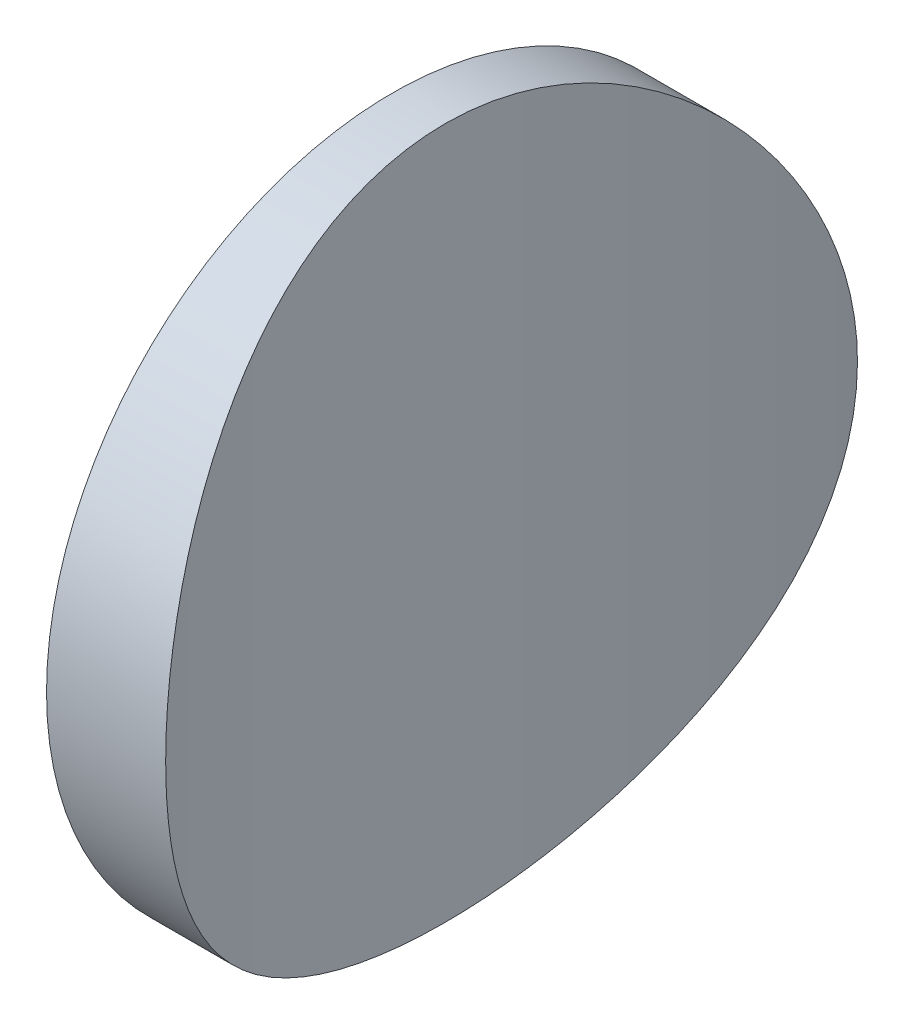
ISO-10303-21;
HEADER;
FILE_DESCRIPTION(('STEP AP214'),'2;1');
FILE_NAME('part.step','',(''),(''),'','','');
FILE_SCHEMA(('AUTOMOTIVE_DESIGN { 1 0 10303 214 1 1 1 1 }'));
ENDSEC;
DATA;
#1=APPLICATION_CONTEXT('core data for automotive mechanical design processes');
#2=APPLICATION_PROTOCOL_DEFINITION('international standard','automotive_design',2000,#1);
#3=PRODUCT_CONTEXT('',#1,'mechanical');
#4=PRODUCT('Part','Part','',(#3));
#5=PRODUCT_RELATED_PRODUCT_CATEGORY('part','',(#4));
#6=PRODUCT_DEFINITION_FORMATION('','',#4);
#7=PRODUCT_DEFINITION_CONTEXT('part definition',#1,'design');
#8=PRODUCT_DEFINITION('design','',#6,#7);
#9=PRODUCT_DEFINITION_SHAPE('','',#8);
#10=(LENGTH_UNIT() NAMED_UNIT(*) SI_UNIT(.MILLI.,.METRE.));
#11=(NAMED_UNIT(*) PLANE_ANGLE_UNIT() SI_UNIT($,.RADIAN.));
#12=(NAMED_UNIT(*) SI_UNIT($,.STERADIAN.) SOLID_ANGLE_UNIT());
#13=UNCERTAINTY_MEASURE_WITH_UNIT(LENGTH_MEASURE(1.E-05),#10,'distance_accuracy_value','');
#14=(GEOMETRIC_REPRESENTATION_CONTEXT(3) GLOBAL_UNCERTAINTY_ASSIGNED_CONTEXT((#13)) GLOBAL_UNIT_ASSIGNED_CONTEXT((#10,
#11,#12)) REPRESENTATION_CONTEXT('',''));
#15=CARTESIAN_POINT('',(0.,0.,0.));
#16=DIRECTION('',(0.,0.,1.));
#17=DIRECTION('',(1.,0.,0.));
#18=AXIS2_PLACEMENT_3D('',#15,#16,#17);
#19=CARTESIAN_POINT('',(50.,0.,0.));
#20=DIRECTION('',(-1.,0.,0.));
#21=DIRECTION('',(0.,0.,1.));
#22=AXIS2_PLACEMENT_3D('',#19,#20,#21);
#23=CYLINDRICAL_SURFACE('',#22,85.);
#24=CARTESIAN_POINT('',(29.2828972683749,0.,85.));
#25=CARTESIAN_POINT('',(29.2828978036341,1.1488404539939,85.0000005997146));
#26=CARTESIAN_POINT('',(29.2736276574015,2.29766431903944,84.9767041350278));
#27=CARTESIAN_POINT('',(29.2366245887519,4.59323073448236,84.8835783484398));
#28=CARTESIAN_POINT('',(29.2088901211114,5.73997310263108,84.8137451320179));
#29=CARTESIAN_POINT('',(29.1351943582932,8.02890773503969,84.6277430593583));
#30=CARTESIAN_POINT('',(29.0892361186256,9.1711007296658,84.5115819707187));
#31=CARTESIAN_POINT('',(28.9794689287804,11.4491126497427,84.2332158756168));
#32=CARTESIAN_POINT('',(28.9156582062596,12.5849309309041,84.0710062975693));
#33=CARTESIAN_POINT('',(28.7707214911127,14.8478475787221,83.7009897663188));
#34=CARTESIAN_POINT('',(28.6895977370605,15.9749470532144,83.4931887079939));
#35=CARTESIAN_POINT('',(28.5106784733204,18.2186652459537,83.0324756142021));
#36=CARTESIAN_POINT('',(28.4128813146447,19.3352829160225,82.7795591167358));
#37=CARTESIAN_POINT('',(28.2014086334056,21.5558896821094,82.229264900523));
#38=CARTESIAN_POINT('',(28.0877343512104,22.6598797573509,81.9318906548204));
#39=CARTESIAN_POINT('',(27.8453791487861,24.8535590133874,81.2933314653966));
#40=CARTESIAN_POINT('',(27.7166967819731,25.9432468043481,80.9521422981664));
#41=CARTESIAN_POINT('',(27.4456596965471,28.1037242694639,80.2276483888712));
#42=CARTESIAN_POINT('',(27.3033400046667,29.1745544174246,79.8444511954802));
#43=CARTESIAN_POINT('',(27.0058072738449,31.2985166425699,79.0360311697076));
#44=CARTESIAN_POINT('',(26.8505930341754,32.3516470605696,78.6108044228728));
#45=CARTESIAN_POINT('',(26.5284265684189,34.4384171703767,77.719254491178));
#46=CARTESIAN_POINT('',(26.3614755981908,35.4720589325532,77.2529357019177));
#47=CARTESIAN_POINT('',(26.0170104199755,37.5184705078629,76.2800660016033));
#48=CARTESIAN_POINT('',(25.8394952535187,38.5312384158934,75.7735114386333));
#49=CARTESIAN_POINT('',(25.2928906101731,41.5362913491117,74.194714925307));
#50=CARTESIAN_POINT('',(24.9097338604588,43.4953776034085,73.063317899803));
#51=CARTESIAN_POINT('',(24.1163738370781,47.3131162401412,70.6510427118328));
#52=CARTESIAN_POINT('',(23.706169659231,49.1717652612324,69.3701595510237));
#53=CARTESIAN_POINT('',(22.8508581435871,52.8582877320337,66.6073311634554));
#54=CARTESIAN_POINT('',(22.4050090798853,54.6812328356513,65.1190299948578));
#55=CARTESIAN_POINT('',(21.507401162804,58.196741178176,61.9973064161845));
#56=CARTESIAN_POINT('',(21.0556421614623,59.8893011454034,60.3638803667864));
#57=CARTESIAN_POINT('',(20.1580869045897,63.1343827982284,56.9611944853285));
#58=CARTESIAN_POINT('',(19.7122918360274,64.6868769503178,55.191908072435));
#59=CARTESIAN_POINT('',(18.8384199582269,67.6417500199597,51.5279798780516));
#60=CARTESIAN_POINT('',(18.4103433720162,69.0441270482984,49.6333365194386));
#61=CARTESIAN_POINT('',(17.5694466129426,71.7329704430191,45.6652198053548));
#62=CARTESIAN_POINT('',(17.1575959610848,73.0140851249509,43.5879084700608));
#63=CARTESIAN_POINT('',(16.3763550886469,75.3959059561111,39.3245426293567));
#64=CARTESIAN_POINT('',(16.0069660719377,76.4966069906341,37.1384850432928));
#65=CARTESIAN_POINT('',(15.3213478253664,78.5077224434308,32.67310323027));
#66=CARTESIAN_POINT('',(15.0051047742647,79.4181863501621,30.393803444377));
#67=CARTESIAN_POINT('',(14.4349603556081,81.0404504648236,25.7580074932266));
#68=CARTESIAN_POINT('',(14.1810556453745,81.7522613251183,23.4015154748197));
#69=CARTESIAN_POINT('',(13.7523970860038,82.9443151838728,18.7298072832855));
#70=CARTESIAN_POINT('',(13.5747665232454,83.4330291864961,16.4170150956375));
#71=CARTESIAN_POINT('',(13.2886936319175,84.216492795123,11.7545624137274));
#72=CARTESIAN_POINT('',(13.1802495351306,84.5112473582065,9.40490286326722));
#73=CARTESIAN_POINT('',(13.0356692036713,84.9036320954959,4.68759940349774));
#74=CARTESIAN_POINT('',(12.9995134362693,85.001315519541,2.31996052592241));
#75=CARTESIAN_POINT('',(13.0004964141647,84.9986578263105,-2.41515735028337));
#76=CARTESIAN_POINT('',(13.0376330164364,84.8983224989863,-4.78263635156438));
#77=CARTESIAN_POINT('',(13.1805830319454,84.5103225232153,-9.38506965526903));
#78=CARTESIAN_POINT('',(13.2830039976592,84.2319092036605,-11.6209167856377));
#79=CARTESIAN_POINT('',(13.5505969874069,83.499369883874,-16.0597265536594));
#80=CARTESIAN_POINT('',(13.7157666248463,83.0452505664643,-18.2626904386884));
#81=CARTESIAN_POINT('',(14.1046484931826,81.9654521245874,-22.6209003702631));
#82=CARTESIAN_POINT('',(14.3283628302607,81.3397668278907,-24.7761446970425));
#83=CARTESIAN_POINT('',(14.8287296087294,79.9222627661008,-29.0249501918653));
#84=CARTESIAN_POINT('',(15.1053834029762,79.1304397553448,-31.1185097819907));
#85=CARTESIAN_POINT('',(15.7091535665823,77.3745310488023,-35.2606672700654));
#86=CARTESIAN_POINT('',(16.0369376379191,76.40813456232,-37.3081875389039));
#87=CARTESIAN_POINT('',(16.7319031257394,74.3183850110616,-41.3144319627309));
#88=CARTESIAN_POINT('',(17.0990846782683,73.1950314042852,-43.273155811059));
#89=CARTESIAN_POINT('',(17.8640477482082,70.7989125984089,-47.0913509992984));
#90=CARTESIAN_POINT('',(18.2618371074595,69.5261090654212,-48.9507966956752));
#91=CARTESIAN_POINT('',(19.078415808562,66.8394608319852,-52.5599482853329));
#92=CARTESIAN_POINT('',(19.4972059318174,65.4256108814897,-54.3096500897619));
#93=CARTESIAN_POINT('',(20.3700156704807,62.380736525482,-57.7865314073028));
#94=CARTESIAN_POINT('',(20.8246824824698,60.7419257224109,-59.5067381950638));
#95=CARTESIAN_POINT('',(21.7341354674863,57.3261984175831,-62.8040056590945));
#96=CARTESIAN_POINT('',(22.1889216443591,55.5492767250327,-64.3810609502893));
#97=CARTESIAN_POINT('',(23.0863673361428,51.8670670088073,-67.3828532989033));
#98=CARTESIAN_POINT('',(23.5290239492364,49.9617486388364,-68.8075541403727));
#99=CARTESIAN_POINT('',(24.174350121499,47.0168432908965,-70.8225440639825));
#100=CARTESIAN_POINT('',(24.3863761872441,46.0205810255967,-71.4739428393987));
#101=CARTESIAN_POINT('',(24.8026990776297,44.0004385644442,-72.734989033998));
#102=CARTESIAN_POINT('',(25.0069966269655,42.9765609735533,-73.3446403721626));
#103=CARTESIAN_POINT('',(25.410586267501,40.8807139664058,-74.5335462726285));
#104=CARTESIAN_POINT('',(25.6096802022047,39.8081850995183,-75.1118815109666));
#105=CARTESIAN_POINT('',(25.9966370145169,37.6377421145244,-76.2226101225812));
#106=CARTESIAN_POINT('',(26.1845010124674,36.5398305439003,-76.7550080810958));
#107=CARTESIAN_POINT('',(26.5475171728706,34.3202009665447,-77.7728403293699));
#108=CARTESIAN_POINT('',(26.7226676229485,33.1984797791195,-78.2582682957108));
#109=CARTESIAN_POINT('',(27.0587512923736,30.9334298671202,-79.1809204888749));
#110=CARTESIAN_POINT('',(27.2196860559437,29.7901035058947,-79.6181499526922));
#111=CARTESIAN_POINT('',(27.5259348347759,27.4841446436552,-80.4432773153081));
#112=CARTESIAN_POINT('',(27.6712539016668,26.3215185274142,-80.8311911750287));
#113=CARTESIAN_POINT('',(27.9450449822097,23.9788809385225,-81.5568312083606));
#114=CARTESIAN_POINT('',(28.0735187838738,22.7988713258273,-81.894562709001));
#115=CARTESIAN_POINT('',(28.3124875244281,20.4236179022307,-82.518990336163));
#116=CARTESIAN_POINT('',(28.4229824264475,19.2283740600927,-82.8056863580224));
#117=CARTESIAN_POINT('',(28.6249817418168,16.8250452533378,-83.3272452233208));
#118=CARTESIAN_POINT('',(28.7164863974126,15.6169604527311,-83.5621087279553));
#119=CARTESIAN_POINT('',(28.875254473443,13.255877002689,-83.9680785831171));
#120=CARTESIAN_POINT('',(28.943559111169,12.1034213293907,-84.1419403328443));
#121=CARTESIAN_POINT('',(29.0618395534812,9.79129886062915,-84.4422262659381));
#122=CARTESIAN_POINT('',(29.1118137407,8.63163143802128,-84.5686462633563));
#123=CARTESIAN_POINT('',(29.1929913440053,6.30757045617007,-84.7736705000148));
#124=CARTESIAN_POINT('',(29.2241971434845,5.14317751593356,-84.8522808106091));
#125=CARTESIAN_POINT('',(29.2675811839868,2.81166991260089,-84.9615007337674));
#126=CARTESIAN_POINT('',(29.2797575159023,1.64455498818674,-84.9921055302394));
#127=CARTESIAN_POINT('',(29.284970440448,-0.689679539370886,-85.0052127220533));
#128=CARTESIAN_POINT('',(29.2780120836193,-1.85679905998466,-84.9877278105229));
#129=CARTESIAN_POINT('',(29.245026589399,-4.18906442966734,-84.9047309234201));
#130=CARTESIAN_POINT('',(29.2189993559306,-5.35421026876238,-84.8392187058665));
#131=CARTESIAN_POINT('',(29.1481016082263,-7.68021864028846,-84.6603496210638));
#132=CARTESIAN_POINT('',(29.1032315202771,-8.84108126902035,-84.5469938361916));
#133=CARTESIAN_POINT('',(28.9950324676841,-11.1563106137547,-84.2727452877828));
#134=CARTESIAN_POINT('',(28.9317035429054,-12.3106773437806,-84.11185262691));
#135=CARTESIAN_POINT('',(28.7904315979892,-14.5581200880013,-83.7513969508285));
#136=CARTESIAN_POINT('',(28.7132893360262,-15.6515848334032,-83.5539388474364));
#137=CARTESIAN_POINT('',(28.5432682372227,-17.8288486159233,-83.1165761696457));
#138=CARTESIAN_POINT('',(28.4503880924268,-18.9126468417825,-82.8766680672087));
#139=CARTESIAN_POINT('',(28.2496021058477,-21.0685789481666,-82.3549922899518));
#140=CARTESIAN_POINT('',(28.1416981896297,-22.1407143045416,-82.0732299791888));
#141=CARTESIAN_POINT('',(27.9116553989727,-24.2717706593564,-81.4684504559517));
#142=CARTESIAN_POINT('',(27.7895153007257,-25.3306905130553,-81.1454296964815));
#143=CARTESIAN_POINT('',(27.4030262818264,-28.4852097409643,-80.1154465699817));
#144=CARTESIAN_POINT('',(27.1185868159575,-30.5587999256885,-79.3475073229573));
#145=CARTESIAN_POINT('',(26.5041231080966,-34.6341519441487,-77.6552920997197));
#146=CARTESIAN_POINT('',(26.1740970820109,-36.6359109628071,-76.7310100044927));
#147=CARTESIAN_POINT('',(25.6451771030876,-39.6121243342766,-75.2142359109952));
#148=CARTESIAN_POINT('',(25.4596584999444,-40.6171264956772,-74.6762790073898));
#149=CARTESIAN_POINT('',(25.080047911007,-42.6034676664479,-73.5611410569584));
#150=CARTESIAN_POINT('',(24.8859563599901,-43.5848078719416,-72.9839619984875));
#151=CARTESIAN_POINT('',(24.4905289768071,-45.522394737069,-71.7914034584901));
#152=CARTESIAN_POINT('',(24.2891936604419,-46.4786431750398,-71.1760266946227));
#153=CARTESIAN_POINT('',(23.8805721725855,-48.3649857665678,-69.9079413859421));
#154=CARTESIAN_POINT('',(23.6732847204966,-49.2950742053134,-69.2552247770573));
#155=CARTESIAN_POINT('',(23.0445028475725,-52.0442422876373,-67.2425099360767));
#156=CARTESIAN_POINT('',(22.61608842932,-53.8222270275522,-65.8279452544585));
#157=CARTESIAN_POINT('',(21.7518396680258,-57.2583155207887,-62.862042962113));
#158=CARTESIAN_POINT('',(21.3160050934079,-58.9164155241171,-61.3107010763621));
#159=CARTESIAN_POINT('',(20.6515243310406,-61.3555775989575,-58.8382879843381));
#160=CARTESIAN_POINT('',(20.4216063372579,-62.1831423160667,-57.9629892942384));
#161=CARTESIAN_POINT('',(19.9643468881886,-63.800502189205,-56.1778067314758));
#162=CARTESIAN_POINT('',(19.737004854275,-64.5903059610052,-55.267930834022));
#163=CARTESIAN_POINT('',(19.2863935205421,-66.1310863219919,-53.4147154332134));
#164=CARTESIAN_POINT('',(19.063124755895,-66.8820578325896,-52.4713715798932));
#165=CARTESIAN_POINT('',(18.6222057411863,-68.3438379548355,-50.552689243237));
#166=CARTESIAN_POINT('',(18.4045558293705,-69.0546441516457,-49.5773488417496));
#167=CARTESIAN_POINT('',(17.976395451159,-70.4347424384693,-47.5962639803211));
#168=CARTESIAN_POINT('',(17.7658846879358,-71.1040362554228,-46.590520787747));
#169=CARTESIAN_POINT('',(17.3534273921568,-72.3999523272439,-44.5500588728844));
#170=CARTESIAN_POINT('',(17.1514816552398,-73.0265706210762,-43.5153374734559));
#171=CARTESIAN_POINT('',(16.7576000493502,-74.2357748891636,-41.4187640102402));
#172=CARTESIAN_POINT('',(16.5656631209959,-74.8183655264682,-40.3569148355896));
#173=CARTESIAN_POINT('',(16.1931050679311,-75.9384393402542,-38.2076177881461));
#174=CARTESIAN_POINT('',(16.0124849363874,-76.4759185591407,-37.1201676800941));
#175=CARTESIAN_POINT('',(15.6645539231084,-77.5024988347043,-34.9259772579497));
#176=CARTESIAN_POINT('',(15.4971927808495,-77.9917844828052,-33.8193312997698));
#177=CARTESIAN_POINT('',(15.1761727537874,-78.9233010047073,-31.5844602298271));
#178=CARTESIAN_POINT('',(15.022513772152,-79.3655322110427,-30.4562352706299));
#179=CARTESIAN_POINT('',(14.7299911917545,-80.2019354216148,-28.1801294982404));
#180=CARTESIAN_POINT('',(14.5911285779551,-80.5961042266914,-27.0322473824092));
#181=CARTESIAN_POINT('',(14.3292334853137,-81.3353486055841,-24.7191253882342));
#182=CARTESIAN_POINT('',(14.2061994037257,-81.6804291502938,-23.5538872806548));
#183=CARTESIAN_POINT('',(13.9768803197887,-82.3205845400064,-21.2084574821411));
#184=CARTESIAN_POINT('',(13.8705908705645,-82.6156726630808,-20.0282698516114));
#185=CARTESIAN_POINT('',(13.6755217182084,-83.1551537282479,-17.6550569329883));
#186=CARTESIAN_POINT('',(13.586740185274,-83.3995519682235,-16.4620330002119));
#187=CARTESIAN_POINT('',(13.4273384417329,-83.8370349934866,-14.0653969833333));
#188=CARTESIAN_POINT('',(13.3567183847057,-84.0301193448471,-12.8617848097824));
#189=CARTESIAN_POINT('',(13.2341757059584,-84.3644369579468,-10.4464413686785));
#190=CARTESIAN_POINT('',(13.1822528469971,-84.5056708775959,-9.23471020434279));
#191=CARTESIAN_POINT('',(13.0999091087021,-84.7293451763899,-6.87473270069915));
#192=CARTESIAN_POINT('',(13.0684331659656,-84.8146728441557,-5.72679578881819));
#193=CARTESIAN_POINT('',(13.0226731324019,-84.938649673733,-3.42795675524289));
#194=CARTESIAN_POINT('',(13.0083905248578,-84.9772948082051,-2.27705438629828));
#195=CARTESIAN_POINT('',(12.9971208006463,-85.0077916285522,0.0253019334552542));
#196=CARTESIAN_POINT('',(13.0001314042362,-84.9996494823367,1.17675579155108));
#197=CARTESIAN_POINT('',(13.02342325496,-84.9366040610478,3.47832011016258));
#198=CARTESIAN_POINT('',(13.0437061881503,-84.8816962208926,4.62843042855147));
#199=CARTESIAN_POINT('',(13.1014005894745,-84.7252694974346,6.92480201639188));
#200=CARTESIAN_POINT('',(13.138808466263,-84.6237603870716,8.0710640421388));
#201=CARTESIAN_POINT('',(13.2305020090973,-84.374377924849,10.3579686812187));
#202=CARTESIAN_POINT('',(13.2847893536271,-84.2264999620865,11.4986107242402));
#203=CARTESIAN_POINT('',(13.4098672108819,-83.8847682753237,13.7719549920671));
#204=CARTESIAN_POINT('',(13.4806560634196,-83.6909191763636,14.9046580038033));
#205=CARTESIAN_POINT('',(13.6382721392059,-83.257689844217,17.1603064606317));
#206=CARTESIAN_POINT('',(13.7251008653128,-83.0183053445217,18.2832509810693));
#207=CARTESIAN_POINT('',(13.9120082600106,-82.5006958739665,20.4912374234434));
#208=CARTESIAN_POINT('',(14.0117307395215,-82.22350679067,21.5765525674731));
#209=CARTESIAN_POINT('',(14.2252992325864,-81.6268417861765,23.7341886675224));
#210=CARTESIAN_POINT('',(14.3391465122751,-81.3073620739125,24.8065084491785));
#211=CARTESIAN_POINT('',(14.5802378374579,-80.6268505039457,26.9362282086437));
#212=CARTESIAN_POINT('',(14.7074803003231,-80.2658235545435,27.9936299323049));
#213=CARTESIAN_POINT('',(14.9745844860868,-79.5029405940018,30.092013754723));
#214=CARTESIAN_POINT('',(15.1144473472592,-79.1010808996143,31.1329943624396));
#215=CARTESIAN_POINT('',(15.5517255071084,-77.835379561144,34.2289804156103));
#216=CARTESIAN_POINT('',(15.8668594284847,-76.911334415206,36.2572840003315));
#217=CARTESIAN_POINT('',(16.5366911441671,-74.9100703109988,40.2297153337018));
#218=CARTESIAN_POINT('',(16.891390375377,-73.8328457892835,42.1738400216421));
#219=CARTESIAN_POINT('',(17.6474052192262,-71.4848101244641,46.0462669394069));
#220=CARTESIAN_POINT('',(18.0500438275346,-70.207824650984,47.9705715152034));
#221=CARTESIAN_POINT('',(18.879085265999,-67.5043647029573,51.7056689002868));
#222=CARTESIAN_POINT('',(19.3054886286207,-66.0778868783007,53.5164591642742));
#223=CARTESIAN_POINT('',(20.1715064874147,-63.084003362132,57.0150119672312));
#224=CARTESIAN_POINT('',(20.6111250066679,-61.516554459624,58.7027364945941));
#225=CARTESIAN_POINT('',(21.4924700487041,-58.2499614063915,61.9454366255603));
#226=CARTESIAN_POINT('',(21.9341966353504,-56.5508132418125,63.5004081801571));
#227=CARTESIAN_POINT('',(22.6009129531779,-53.8661364289269,65.7640023127831));
#228=CARTESIAN_POINT('',(22.8293143965904,-52.9244482870937,66.524192720727));
#229=CARTESIAN_POINT('',(23.2819120016093,-51.0088627394275,68.0041197608682));
#230=CARTESIAN_POINT('',(23.5061085275183,-50.0349681442644,68.7238599084546));
#231=CARTESIAN_POINT('',(23.9486836173342,-48.0563124708015,70.1217401923644));
#232=CARTESIAN_POINT('',(24.1670614355961,-47.0515474717611,70.7998750114904));
#233=CARTESIAN_POINT('',(24.5963192820693,-45.0128932285737,72.1131711339238));
#234=CARTESIAN_POINT('',(24.8072000653657,-43.9790069363669,72.7483367708458));
#235=CARTESIAN_POINT('',(25.2199148907225,-41.8834207811256,73.9746795098918));
#236=CARTESIAN_POINT('',(25.4217471478327,-40.821715495278,74.5658479479934));
#237=CARTESIAN_POINT('',(25.8147215409936,-38.6724865459974,75.7028175875706));
#238=CARTESIAN_POINT('',(26.0058647645556,-37.5849655251752,76.2486234070348));
#239=CARTESIAN_POINT('',(26.3759714644085,-35.385658373118,77.2938399309964));
#240=CARTESIAN_POINT('',(26.5549335495453,-34.2738694894428,77.7932453386774));
#241=CARTESIAN_POINT('',(26.8991648736478,-32.0281438352343,78.7444275362827));
#242=CARTESIAN_POINT('',(27.0644354216521,-30.8942091948817,79.1962088806393));
#243=CARTESIAN_POINT('',(27.3849106916548,-28.5697980235986,80.0646882100907));
#244=CARTESIAN_POINT('',(27.5396301621338,-27.378668658676,80.4798197950215));
#245=CARTESIAN_POINT('',(27.8316044950421,-24.9771671257187,81.2572089254219));
#246=CARTESIAN_POINT('',(27.9688593897159,-23.7667949932161,81.6194665685112));
#247=CARTESIAN_POINT('',(28.2246170938383,-21.3291877191535,82.2901193110572));
#248=CARTESIAN_POINT('',(28.3431189576283,-20.1019517305896,82.5985116943328));
#249=CARTESIAN_POINT('',(28.5602175787335,-17.6332651842358,83.1605103961457));
#250=CARTESIAN_POINT('',(28.6588145766044,-16.3918147984224,83.414117376782));
#251=CARTESIAN_POINT('',(28.835096176999,-13.8979280459682,83.8656825954426));
#252=CARTESIAN_POINT('',(28.9127900488509,-12.6454968039629,84.0636655012587));
#253=CARTESIAN_POINT('',(29.0465389359643,-10.1320369332122,84.403494375312));
#254=CARTESIAN_POINT('',(29.1025964806309,-8.87100932698025,84.5453469055461));
#255=CARTESIAN_POINT('',(29.1925174489558,-6.34311459390153,84.7724915915304));
#256=CARTESIAN_POINT('',(29.226381446176,-5.07624761881744,84.8577852089687));
#257=CARTESIAN_POINT('',(29.2715707987146,-2.53958029485861,84.9715384227082));
#258=CARTESIAN_POINT('',(29.2828966767686,-1.26978001470108,84.9999993371529));
#259=CARTESIAN_POINT('',(29.2828972683749,0.,85.));
#260=B_SPLINE_CURVE_WITH_KNOTS('',3,(#24,#25,#26,#27,#28,#29,#30,#31,#32,#33,#34,#35,#36,#37,
#38,#39,#40,#41,#42,#43,#44,#45,#46,#47,#48,#49,#50,#51,#52,#53,#54,#55,#56,#57,#58,#59,#60,#61,
#62,#63,#64,#65,#66,#67,#68,#69,#70,#71,#72,#73,#74,#75,#76,#77,#78,#79,#80,#81,#82,#83,#84,#85,
#86,#87,#88,#89,#90,#91,#92,#93,#94,#95,#96,#97,#98,#99,#100,#101,#102,#103,#104,#105,#106,#107,
#108,#109,#110,#111,#112,#113,#114,#115,#116,#117,#118,#119,#120,#121,#122,#123,#124,#125,#126,
#127,#128,#129,#130,#131,#132,#133,#134,#135,#136,#137,#138,#139,#140,#141,#142,#143,#144,#145,
#146,#147,#148,#149,#150,#151,#152,#153,#154,#155,#156,#157,#158,#159,#160,#161,#162,#163,#164,
#165,#166,#167,#168,#169,#170,#171,#172,#173,#174,#175,#176,#177,#178,#179,#180,#181,#182,#183,
#184,#185,#186,#187,#188,#189,#190,#191,#192,#193,#194,#195,#196,#197,#198,#199,#200,#201,#202,
#203,#204,#205,#206,#207,#208,#209,#210,#211,#212,#213,#214,#215,#216,#217,#218,#219,#220,#221,
#222,#223,#224,#225,#226,#227,#228,#229,#230,#231,#232,#233,#234,#235,#236,#237,#238,#239,#240,
#241,#242,#243,#244,#245,#246,#247,#248,#249,#250,#251,#252,#253,#254,#255,#256,#257,#258,#259),
.UNSPECIFIED.,.T.,.F.,(4,2,2,2,2,2,2,2,2,2,2,2,2,2,2,2,2,2,2,2,2,2,2,2,2,2,2,2,2,2,2,2,2,2,2,2,
2,2,2,2,2,2,2,2,2,2,2,2,2,2,2,2,2,2,2,2,2,2,2,2,2,2,2,2,2,2,2,2,2,2,2,2,2,2,2,2,2,2,2,2,2,2,2,2,
2,2,2,2,2,2,2,2,2,2,2,2,2,2,2,2,2,2,2,2,2,2,2,2,2,2,2,2,2,2,2,2,2,4),(0.,3.44621950125319,
6.89272744246533,10.3386577650487,13.7849303111522,17.2307575241256,20.6769257248492,
24.1228248510921,27.5690563920753,31.0066623428785,34.4445887598539,37.88214786857,
41.3200193374477,48.1955912967841,55.0713932193729,62.2488758984333,69.4265386193392,
76.605609232582,83.7847701833174,91.2008242984165,98.6170886214109,106.031421262114,
113.445356247924,120.54787193919,127.650206102268,134.750620913603,141.850828116076,
148.609203507228,155.367321874812,162.125683403255,168.884217663214,175.739821653823,
182.595449318608,189.452839308306,196.310484639926,203.559144666355,210.808077260068,
218.058729174322,221.685026114369,225.310982172942,229.01386719355,232.716382181404,
236.41939493541,240.122004942259,243.823413537501,247.52442893443,251.225451921224,
254.926427693614,258.42780373206,261.929488636324,265.430728768585,268.93232013585,
272.432987357766,275.933672217601,279.434277884815,282.934875991926,286.275388305924,
289.616178381916,292.95654066935,296.297190321851,302.977775272132,309.658621750551,
313.122588167917,316.586379111385,320.049923897731,323.514219530642,330.442802484262,
337.371602070197,341.049663120815,344.726880917663,348.404578421009,352.082496801885,
355.76026207637,359.438368247894,363.116084316943,366.794122693084,370.457475745133,
374.120802906493,377.784373775603,381.447573390892,385.109798523636,388.771640703675,
392.433513848465,396.095340527582,399.548878134673,403.002713659939,406.456093880791,
409.909811245598,413.362804648078,416.81614152399,420.269131115666,423.722444399966,
427.09523020826,430.468318568855,433.841008848392,437.21400362622,443.95919104314,
450.704623506598,457.72971541017,464.754964779096,471.782374941877,478.809999366314,
482.503881428026,486.197441969517,489.89147357219,493.585132059815,497.27951599649,
500.973523376995,504.667951928334,508.362026849234,512.173219429049,515.984404972265,
519.795782640859,523.607114245168,527.416752948093,531.22594614842,535.035040901503,
538.844047307703),.UNSPECIFIED.);
#261=CARTESIAN_POINT('',(29.2828972683749,0.,85.));
#262=VERTEX_POINT('',#261);
#263=EDGE_CURVE('E10',#262,#262,#260,.T.);
#264=ORIENTED_EDGE('',*,*,#263,.T.);
#265=EDGE_LOOP('',(#264));
#266=FACE_BOUND('',#265,.T.);
#267=CARTESIAN_POINT('',(0.,0.,0.));
#268=DIRECTION('',(1.,0.,0.));
#269=DIRECTION('',(0.,0.,-1.));
#270=AXIS2_PLACEMENT_3D('',#267,#268,#269);
#271=CIRCLE('',#270,85.);
#272=CARTESIAN_POINT('',(0.,0.,-85.));
#273=VERTEX_POINT('',#272);
#274=EDGE_CURVE('E43',#273,#273,#271,.T.);
#275=ORIENTED_EDGE('',*,*,#274,.T.);
#276=EDGE_LOOP('',(#275));
#277=FACE_BOUND('',#276,.T.);
#278=ADVANCED_FACE('F33',(#266,#277),#23,.T.);
#279=CARTESIAN_POINT('',(0.,0.,0.));
#280=DIRECTION('',(1.,0.,0.));
#281=DIRECTION('',(0.,0.,-1.));
#282=AXIS2_PLACEMENT_3D('',#279,#280,#281);
#283=PLANE('',#282);
#284=ORIENTED_EDGE('',*,*,#274,.F.);
#285=EDGE_LOOP('',(#284));
#286=FACE_BOUND('',#285,.T.);
#287=ADVANCED_FACE('F50',(#286),#283,.F.);
#288=CARTESIAN_POINT('',(243.,-85.,0.));
#289=DIRECTION('',(0.,1.,0.));
#290=DIRECTION('',(0.,0.,1.));
#291=AXIS2_PLACEMENT_3D('',#288,#289,#290);
#292=CYLINDRICAL_SURFACE('',#291,230.);
#293=ORIENTED_EDGE('',*,*,#263,.F.);
#294=EDGE_LOOP('',(#293));
#295=FACE_BOUND('',#294,.T.);
#296=ADVANCED_FACE('F52',(#295),#292,.F.);
#297=CLOSED_SHELL('',(#278,#287,#296));
#298=MANIFOLD_SOLID_BREP('B2',#297);
#299=ADVANCED_BREP_SHAPE_REPRESENTATION('',(#18,#298),#14);
#300=SHAPE_DEFINITION_REPRESENTATION(#9,#299);
ENDSEC;
END-ISO-10303-21;
